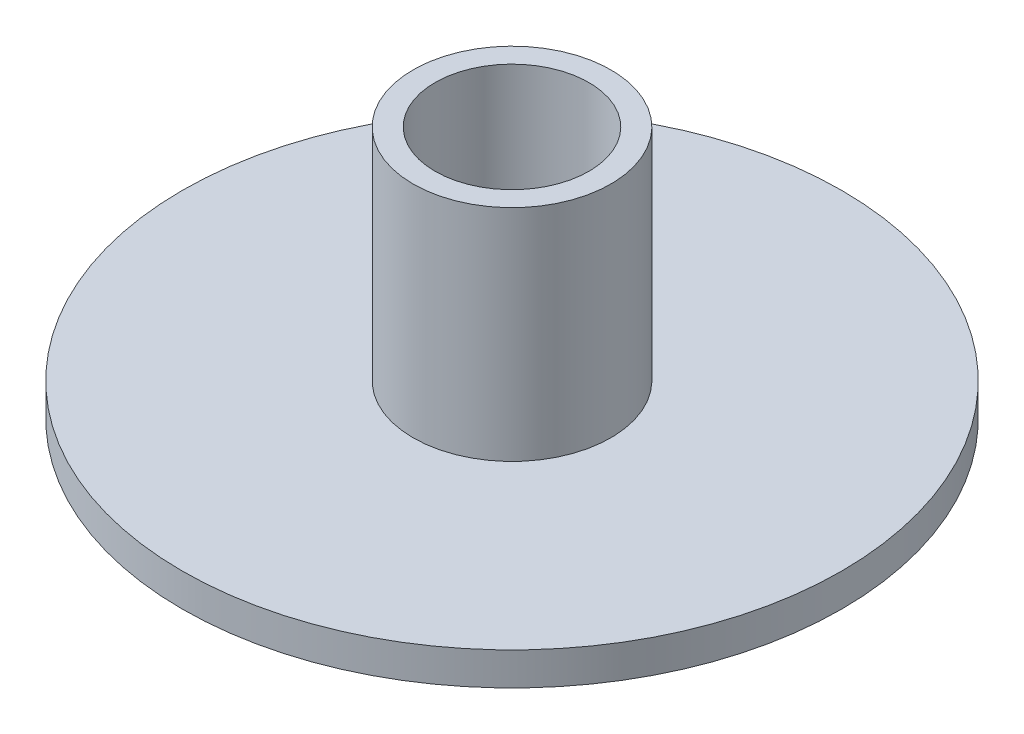
ISO-10303-21;
HEADER;
FILE_DESCRIPTION(('STEP AP214'),'2;1');
FILE_NAME('part.step','',(''),(''),'','','');
FILE_SCHEMA(('AUTOMOTIVE_DESIGN { 1 0 10303 214 1 1 1 1 }'));
ENDSEC;
DATA;
#1=APPLICATION_CONTEXT('core data for automotive mechanical design processes');
#2=APPLICATION_PROTOCOL_DEFINITION('international standard','automotive_design',2000,#1);
#3=PRODUCT_CONTEXT('',#1,'mechanical');
#4=PRODUCT('Part','Part','',(#3));
#5=PRODUCT_RELATED_PRODUCT_CATEGORY('part','',(#4));
#6=PRODUCT_DEFINITION_FORMATION('','',#4);
#7=PRODUCT_DEFINITION_CONTEXT('part definition',#1,'design');
#8=PRODUCT_DEFINITION('design','',#6,#7);
#9=PRODUCT_DEFINITION_SHAPE('','',#8);
#10=(LENGTH_UNIT() NAMED_UNIT(*) SI_UNIT(.MILLI.,.METRE.));
#11=(NAMED_UNIT(*) PLANE_ANGLE_UNIT() SI_UNIT($,.RADIAN.));
#12=(NAMED_UNIT(*) SI_UNIT($,.STERADIAN.) SOLID_ANGLE_UNIT());
#13=UNCERTAINTY_MEASURE_WITH_UNIT(LENGTH_MEASURE(1.E-05),#10,'distance_accuracy_value','');
#14=(GEOMETRIC_REPRESENTATION_CONTEXT(3) GLOBAL_UNCERTAINTY_ASSIGNED_CONTEXT((#13)) GLOBAL_UNIT_ASSIGNED_CONTEXT((#10,
#11,#12)) REPRESENTATION_CONTEXT('',''));
#15=CARTESIAN_POINT('',(0.,0.,0.));
#16=DIRECTION('',(0.,0.,1.));
#17=DIRECTION('',(1.,0.,0.));
#18=AXIS2_PLACEMENT_3D('',#15,#16,#17);
#19=CARTESIAN_POINT('',(0.,28.0586262240942,0.));
#20=DIRECTION('',(0.,1.,0.));
#21=DIRECTION('',(0.,0.,1.));
#22=AXIS2_PLACEMENT_3D('',#19,#20,#21);
#23=CYLINDRICAL_SURFACE('',#22,7.);
#24=CARTESIAN_POINT('',(0.,23.3738939501751,0.));
#25=DIRECTION('',(0.,1.,0.));
#26=DIRECTION('',(0.,0.,1.));
#27=AXIS2_PLACEMENT_3D('',#24,#25,#26);
#28=CIRCLE('',#27,7.);
#29=CARTESIAN_POINT('',(0.,23.3738939501751,7.));
#30=VERTEX_POINT('',#29);
#31=EDGE_CURVE('E10',#30,#30,#28,.T.);
#32=ORIENTED_EDGE('',*,*,#31,.T.);
#33=EDGE_LOOP('',(#32));
#34=FACE_BOUND('',#33,.T.);
#35=CARTESIAN_POINT('',(0.,13.3738939501751,0.));
#36=DIRECTION('',(0.,1.,0.));
#37=DIRECTION('',(0.,0.,1.));
#38=AXIS2_PLACEMENT_3D('',#35,#36,#37);
#39=CIRCLE('',#38,7.);
#40=CARTESIAN_POINT('',(0.,13.3738939501751,7.));
#41=VERTEX_POINT('',#40);
#42=EDGE_CURVE('E72',#41,#41,#39,.T.);
#43=ORIENTED_EDGE('',*,*,#42,.F.);
#44=EDGE_LOOP('',(#43));
#45=FACE_BOUND('',#44,.T.);
#46=ADVANCED_FACE('F37',(#34,#45),#23,.F.);
#47=CARTESIAN_POINT('',(0.,23.3738939501751,9.));
#48=DIRECTION('',(0.,1.,0.));
#49=DIRECTION('',(0.,0.,1.));
#50=AXIS2_PLACEMENT_3D('',#47,#48,#49);
#51=PLANE('',#50);
#52=CARTESIAN_POINT('',(0.,23.3738939501751,0.));
#53=DIRECTION('',(0.,1.,0.));
#54=DIRECTION('',(0.,0.,1.));
#55=AXIS2_PLACEMENT_3D('',#52,#53,#54);
#56=CIRCLE('',#55,9.);
#57=CARTESIAN_POINT('',(0.,23.3738939501751,9.));
#58=VERTEX_POINT('',#57);
#59=EDGE_CURVE('E44',#58,#58,#56,.T.);
#60=ORIENTED_EDGE('',*,*,#59,.T.);
#61=EDGE_LOOP('',(#60));
#62=FACE_BOUND('',#61,.T.);
#63=ORIENTED_EDGE('',*,*,#31,.F.);
#64=EDGE_LOOP('',(#63));
#65=FACE_BOUND('',#64,.T.);
#66=ADVANCED_FACE('F81',(#62,#65),#51,.T.);
#67=CARTESIAN_POINT('',(0.,28.0586262240942,0.));
#68=DIRECTION('',(0.,1.,0.));
#69=DIRECTION('',(0.,0.,1.));
#70=AXIS2_PLACEMENT_3D('',#67,#68,#69);
#71=CYLINDRICAL_SURFACE('',#70,9.);
#72=CARTESIAN_POINT('',(0.,3.37389395017507,0.));
#73=DIRECTION('',(0.,1.,0.));
#74=DIRECTION('',(0.,0.,1.));
#75=AXIS2_PLACEMENT_3D('',#72,#73,#74);
#76=CIRCLE('',#75,9.);
#77=CARTESIAN_POINT('',(0.,3.37389395017507,9.));
#78=VERTEX_POINT('',#77);
#79=EDGE_CURVE('E49',#78,#78,#76,.T.);
#80=ORIENTED_EDGE('',*,*,#79,.T.);
#81=EDGE_LOOP('',(#80));
#82=FACE_BOUND('',#81,.T.);
#83=ORIENTED_EDGE('',*,*,#59,.F.);
#84=EDGE_LOOP('',(#83));
#85=FACE_BOUND('',#84,.T.);
#86=ADVANCED_FACE('F85',(#82,#85),#71,.T.);
#87=CARTESIAN_POINT('',(0.,3.37389395017507,9.));
#88=DIRECTION('',(0.,1.,0.));
#89=DIRECTION('',(0.,0.,1.));
#90=AXIS2_PLACEMENT_3D('',#87,#88,#89);
#91=PLANE('',#90);
#92=CARTESIAN_POINT('',(0.,3.37389395017507,0.));
#93=DIRECTION('',(0.,1.,0.));
#94=DIRECTION('',(0.,0.,1.));
#95=AXIS2_PLACEMENT_3D('',#92,#93,#94);
#96=CIRCLE('',#95,30.);
#97=CARTESIAN_POINT('',(0.,3.37389395017507,30.));
#98=VERTEX_POINT('',#97);
#99=EDGE_CURVE('E54',#98,#98,#96,.T.);
#100=ORIENTED_EDGE('',*,*,#99,.T.);
#101=EDGE_LOOP('',(#100));
#102=FACE_BOUND('',#101,.T.);
#103=ORIENTED_EDGE('',*,*,#79,.F.);
#104=EDGE_LOOP('',(#103));
#105=FACE_BOUND('',#104,.T.);
#106=ADVANCED_FACE('F89',(#102,#105),#91,.T.);
#107=CARTESIAN_POINT('',(0.,28.0586262240942,0.));
#108=DIRECTION('',(0.,1.,0.));
#109=DIRECTION('',(0.,0.,1.));
#110=AXIS2_PLACEMENT_3D('',#107,#108,#109);
#111=CYLINDRICAL_SURFACE('',#110,30.);
#112=CARTESIAN_POINT('',(0.,0.373893950175067,0.));
#113=DIRECTION('',(0.,1.,0.));
#114=DIRECTION('',(0.,0.,1.));
#115=AXIS2_PLACEMENT_3D('',#112,#113,#114);
#116=CIRCLE('',#115,30.);
#117=CARTESIAN_POINT('',(0.,0.373893950175067,30.));
#118=VERTEX_POINT('',#117);
#119=EDGE_CURVE('E60',#118,#118,#116,.T.);
#120=ORIENTED_EDGE('',*,*,#119,.T.);
#121=EDGE_LOOP('',(#120));
#122=FACE_BOUND('',#121,.T.);
#123=ORIENTED_EDGE('',*,*,#99,.F.);
#124=EDGE_LOOP('',(#123));
#125=FACE_BOUND('',#124,.T.);
#126=ADVANCED_FACE('F96',(#122,#125),#111,.T.);
#127=CARTESIAN_POINT('',(0.,0.373893950175069,5.));
#128=DIRECTION('',(0.,-1.,0.));
#129=DIRECTION('',(0.,0.,-1.));
#130=AXIS2_PLACEMENT_3D('',#127,#128,#129);
#131=PLANE('',#130);
#132=CARTESIAN_POINT('',(0.,0.373893950175071,0.));
#133=DIRECTION('',(0.,1.,0.));
#134=DIRECTION('',(0.,0.,1.));
#135=AXIS2_PLACEMENT_3D('',#132,#133,#134);
#136=CIRCLE('',#135,5.);
#137=CARTESIAN_POINT('',(0.,0.373893950175071,5.));
#138=VERTEX_POINT('',#137);
#139=EDGE_CURVE('E64',#138,#138,#136,.T.);
#140=ORIENTED_EDGE('',*,*,#139,.T.);
#141=EDGE_LOOP('',(#140));
#142=FACE_BOUND('',#141,.T.);
#143=ORIENTED_EDGE('',*,*,#119,.F.);
#144=EDGE_LOOP('',(#143));
#145=FACE_BOUND('',#144,.T.);
#146=ADVANCED_FACE('F100',(#142,#145),#131,.T.);
#147=CARTESIAN_POINT('',(0.,28.0586262240942,0.));
#148=DIRECTION('',(0.,1.,0.));
#149=DIRECTION('',(0.,0.,1.));
#150=AXIS2_PLACEMENT_3D('',#147,#148,#149);
#151=CYLINDRICAL_SURFACE('',#150,5.);
#152=CARTESIAN_POINT('',(0.,13.3738939501751,0.));
#153=DIRECTION('',(0.,1.,0.));
#154=DIRECTION('',(0.,0.,1.));
#155=AXIS2_PLACEMENT_3D('',#152,#153,#154);
#156=CIRCLE('',#155,5.);
#157=CARTESIAN_POINT('',(0.,13.3738939501751,5.));
#158=VERTEX_POINT('',#157);
#159=EDGE_CURVE('E68',#158,#158,#156,.T.);
#160=ORIENTED_EDGE('',*,*,#159,.T.);
#161=EDGE_LOOP('',(#160));
#162=FACE_BOUND('',#161,.T.);
#163=ORIENTED_EDGE('',*,*,#139,.F.);
#164=EDGE_LOOP('',(#163));
#165=FACE_BOUND('',#164,.T.);
#166=ADVANCED_FACE('F104',(#162,#165),#151,.F.);
#167=CARTESIAN_POINT('',(0.,13.3738939501751,7.));
#168=DIRECTION('',(0.,1.,0.));
#169=DIRECTION('',(0.,0.,1.));
#170=AXIS2_PLACEMENT_3D('',#167,#168,#169);
#171=PLANE('',#170);
#172=ORIENTED_EDGE('',*,*,#42,.T.);
#173=EDGE_LOOP('',(#172));
#174=FACE_BOUND('',#173,.T.);
#175=ORIENTED_EDGE('',*,*,#159,.F.);
#176=EDGE_LOOP('',(#175));
#177=FACE_BOUND('',#176,.T.);
#178=ADVANCED_FACE('F77',(#174,#177),#171,.T.);
#179=CLOSED_SHELL('',(#46,#66,#86,#106,#126,#146,#166,#178));
#180=MANIFOLD_SOLID_BREP('B2',#179);
#181=ADVANCED_BREP_SHAPE_REPRESENTATION('',(#18,#180),#14);
#182=SHAPE_DEFINITION_REPRESENTATION(#9,#181);
ENDSEC;
END-ISO-10303-21;
